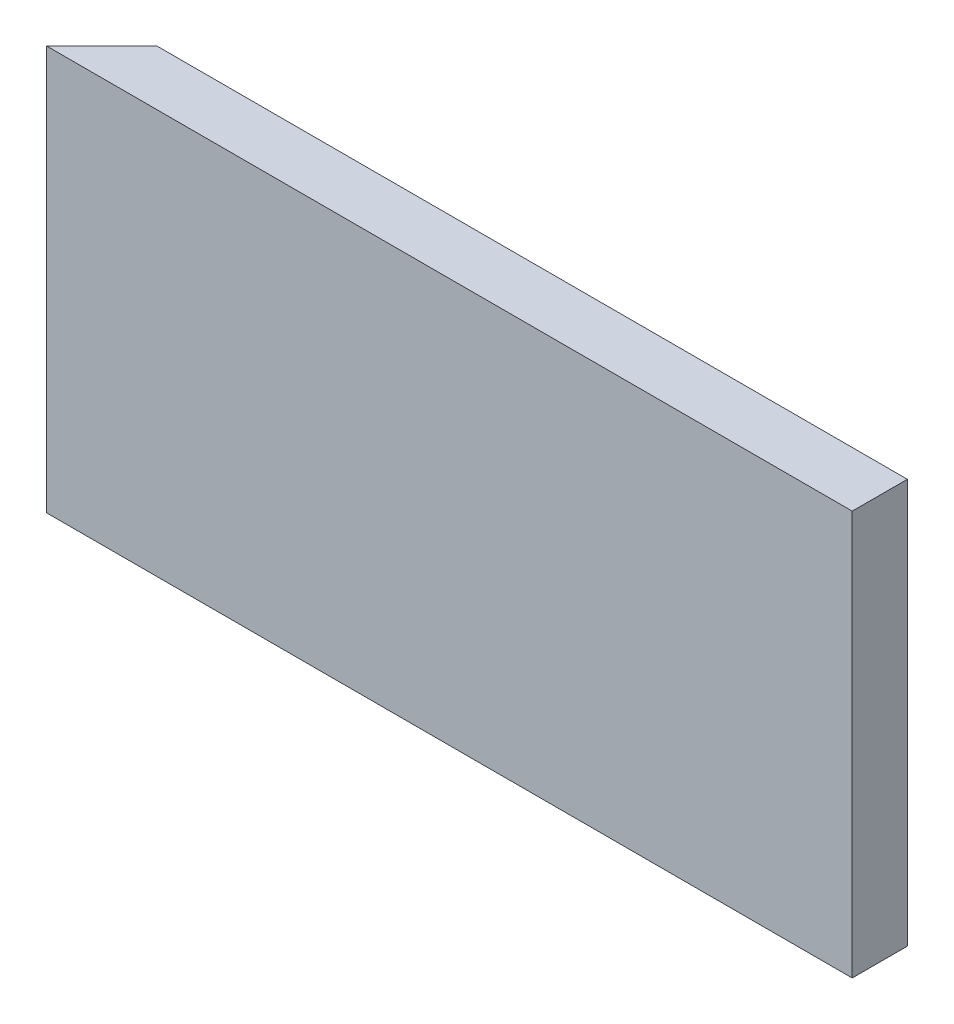
ISO-10303-21;
HEADER;
FILE_DESCRIPTION(('STEP AP214'),'2;1');
FILE_NAME('part.step','',(''),(''),'','','');
FILE_SCHEMA(('AUTOMOTIVE_DESIGN { 1 0 10303 214 1 1 1 1 }'));
ENDSEC;
DATA;
#1=APPLICATION_CONTEXT('core data for automotive mechanical design processes');
#2=APPLICATION_PROTOCOL_DEFINITION('international standard','automotive_design',2000,#1);
#3=PRODUCT_CONTEXT('',#1,'mechanical');
#4=PRODUCT('Part','Part','',(#3));
#5=PRODUCT_RELATED_PRODUCT_CATEGORY('part','',(#4));
#6=PRODUCT_DEFINITION_FORMATION('','',#4);
#7=PRODUCT_DEFINITION_CONTEXT('part definition',#1,'design');
#8=PRODUCT_DEFINITION('design','',#6,#7);
#9=PRODUCT_DEFINITION_SHAPE('','',#8);
#10=(LENGTH_UNIT() NAMED_UNIT(*) SI_UNIT(.MILLI.,.METRE.));
#11=(NAMED_UNIT(*) PLANE_ANGLE_UNIT() SI_UNIT($,.RADIAN.));
#12=(NAMED_UNIT(*) SI_UNIT($,.STERADIAN.) SOLID_ANGLE_UNIT());
#13=UNCERTAINTY_MEASURE_WITH_UNIT(LENGTH_MEASURE(1.E-05),#10,'distance_accuracy_value','');
#14=(GEOMETRIC_REPRESENTATION_CONTEXT(3) GLOBAL_UNCERTAINTY_ASSIGNED_CONTEXT((#13)) GLOBAL_UNIT_ASSIGNED_CONTEXT((#10,
#11,#12)) REPRESENTATION_CONTEXT('',''));
#15=CARTESIAN_POINT('',(0.,0.,0.));
#16=DIRECTION('',(0.,0.,1.));
#17=DIRECTION('',(1.,0.,0.));
#18=AXIS2_PLACEMENT_3D('',#15,#16,#17);
#19=CARTESIAN_POINT('',(0.,0.,18.));
#20=DIRECTION('',(-0.707106781186547,0.,-0.707106781186547));
#21=DIRECTION('',(0.,1.,0.));
#22=AXIS2_PLACEMENT_3D('',#19,#20,#21);
#23=PLANE('',#22);
#24=DIRECTION('',(0.,-1.,0.));
#25=VECTOR('',#24,1.);
#26=CARTESIAN_POINT('',(0.,0.,18.));
#27=LINE('',#26,#25);
#28=CARTESIAN_POINT('',(0.,132.,18.));
#29=VERTEX_POINT('',#28);
#30=CARTESIAN_POINT('',(0.,0.,18.));
#31=VERTEX_POINT('',#30);
#32=EDGE_CURVE('E71',#29,#31,#27,.T.);
#33=ORIENTED_EDGE('',*,*,#32,.F.);
#34=DIRECTION('',(-0.707106781186548,0.,0.707106781186548));
#35=VECTOR('',#34,1.);
#36=CARTESIAN_POINT('',(0.,132.,18.));
#37=LINE('',#36,#35);
#38=CARTESIAN_POINT('',(18.,132.,0.));
#39=VERTEX_POINT('',#38);
#40=EDGE_CURVE('E43',#39,#29,#37,.T.);
#41=ORIENTED_EDGE('',*,*,#40,.F.);
#42=DIRECTION('',(0.,1.,0.));
#43=VECTOR('',#42,1.);
#44=CARTESIAN_POINT('',(18.,132.,0.));
#45=LINE('',#44,#43);
#46=CARTESIAN_POINT('',(18.,0.,0.));
#47=VERTEX_POINT('',#46);
#48=EDGE_CURVE('E72',#47,#39,#45,.T.);
#49=ORIENTED_EDGE('',*,*,#48,.F.);
#50=DIRECTION('',(0.707106781186548,0.,-0.707106781186548));
#51=VECTOR('',#50,1.);
#52=CARTESIAN_POINT('',(0.,0.,18.));
#53=LINE('',#52,#51);
#54=EDGE_CURVE('E13',#31,#47,#53,.T.);
#55=ORIENTED_EDGE('',*,*,#54,.F.);
#56=EDGE_LOOP('',(#33,#41,#49,#55));
#57=FACE_BOUND('',#56,.T.);
#58=ADVANCED_FACE('F36',(#57),#23,.T.);
#59=CARTESIAN_POINT('',(0.,0.,18.));
#60=DIRECTION('',(0.,1.,0.));
#61=DIRECTION('',(0.,0.,1.));
#62=AXIS2_PLACEMENT_3D('',#59,#60,#61);
#63=PLANE('',#62);
#64=DIRECTION('',(1.,0.,0.));
#65=VECTOR('',#64,1.);
#66=CARTESIAN_POINT('',(0.,0.,18.));
#67=LINE('',#66,#65);
#68=CARTESIAN_POINT('',(263.,0.,18.));
#69=VERTEX_POINT('',#68);
#70=EDGE_CURVE('E75',#31,#69,#67,.T.);
#71=ORIENTED_EDGE('',*,*,#70,.F.);
#72=ORIENTED_EDGE('',*,*,#54,.T.);
#73=DIRECTION('',(1.,0.,0.));
#74=VECTOR('',#73,1.);
#75=CARTESIAN_POINT('',(0.,0.,0.));
#76=LINE('',#75,#74);
#77=CARTESIAN_POINT('',(263.,0.,0.));
#78=VERTEX_POINT('',#77);
#79=EDGE_CURVE('E96',#47,#78,#76,.T.);
#80=ORIENTED_EDGE('',*,*,#79,.T.);
#81=DIRECTION('',(0.,0.,-1.));
#82=VECTOR('',#81,1.);
#83=CARTESIAN_POINT('',(263.,0.,18.));
#84=LINE('',#83,#82);
#85=EDGE_CURVE('E78',#69,#78,#84,.T.);
#86=ORIENTED_EDGE('',*,*,#85,.F.);
#87=EDGE_LOOP('',(#71,#72,#80,#86));
#88=FACE_BOUND('',#87,.T.);
#89=ADVANCED_FACE('F76',(#88),#63,.F.);
#90=CARTESIAN_POINT('',(263.,0.,18.));
#91=DIRECTION('',(-1.,0.,0.));
#92=DIRECTION('',(0.,0.,1.));
#93=AXIS2_PLACEMENT_3D('',#90,#91,#92);
#94=PLANE('',#93);
#95=DIRECTION('',(0.,1.,0.));
#96=VECTOR('',#95,1.);
#97=CARTESIAN_POINT('',(263.,0.,0.));
#98=LINE('',#97,#96);
#99=CARTESIAN_POINT('',(263.,132.,0.));
#100=VERTEX_POINT('',#99);
#101=EDGE_CURVE('E90',#78,#100,#98,.T.);
#102=ORIENTED_EDGE('',*,*,#101,.T.);
#103=DIRECTION('',(0.,0.,-1.));
#104=VECTOR('',#103,1.);
#105=CARTESIAN_POINT('',(263.,132.,18.));
#106=LINE('',#105,#104);
#107=CARTESIAN_POINT('',(263.,132.,18.));
#108=VERTEX_POINT('',#107);
#109=EDGE_CURVE('E95',#108,#100,#106,.T.);
#110=ORIENTED_EDGE('',*,*,#109,.F.);
#111=DIRECTION('',(0.,1.,0.));
#112=VECTOR('',#111,1.);
#113=CARTESIAN_POINT('',(263.,0.,18.));
#114=LINE('',#113,#112);
#115=EDGE_CURVE('E81',#69,#108,#114,.T.);
#116=ORIENTED_EDGE('',*,*,#115,.F.);
#117=ORIENTED_EDGE('',*,*,#85,.T.);
#118=EDGE_LOOP('',(#102,#110,#116,#117));
#119=FACE_BOUND('',#118,.T.);
#120=ADVANCED_FACE('F110',(#119),#94,.F.);
#121=CARTESIAN_POINT('',(0.,132.,18.));
#122=DIRECTION('',(0.,-1.,0.));
#123=DIRECTION('',(0.,0.,-1.));
#124=AXIS2_PLACEMENT_3D('',#121,#122,#123);
#125=PLANE('',#124);
#126=DIRECTION('',(-1.,0.,0.));
#127=VECTOR('',#126,1.);
#128=CARTESIAN_POINT('',(0.,132.,0.));
#129=LINE('',#128,#127);
#130=EDGE_CURVE('E87',#100,#39,#129,.T.);
#131=ORIENTED_EDGE('',*,*,#130,.T.);
#132=ORIENTED_EDGE('',*,*,#40,.T.);
#133=DIRECTION('',(-1.,0.,0.));
#134=VECTOR('',#133,1.);
#135=CARTESIAN_POINT('',(0.,132.,18.));
#136=LINE('',#135,#134);
#137=EDGE_CURVE('E86',#108,#29,#136,.T.);
#138=ORIENTED_EDGE('',*,*,#137,.F.);
#139=ORIENTED_EDGE('',*,*,#109,.T.);
#140=EDGE_LOOP('',(#131,#132,#138,#139));
#141=FACE_BOUND('',#140,.T.);
#142=ADVANCED_FACE('F103',(#141),#125,.F.);
#143=CARTESIAN_POINT('',(0.,0.,18.));
#144=DIRECTION('',(0.,0.,-1.));
#145=DIRECTION('',(-1.,0.,0.));
#146=AXIS2_PLACEMENT_3D('',#143,#144,#145);
#147=PLANE('',#146);
#148=ORIENTED_EDGE('',*,*,#32,.T.);
#149=ORIENTED_EDGE('',*,*,#70,.T.);
#150=ORIENTED_EDGE('',*,*,#115,.T.);
#151=ORIENTED_EDGE('',*,*,#137,.T.);
#152=EDGE_LOOP('',(#148,#149,#150,#151));
#153=FACE_BOUND('',#152,.T.);
#154=ADVANCED_FACE('F84',(#153),#147,.F.);
#155=CARTESIAN_POINT('',(0.,0.,0.));
#156=DIRECTION('',(0.,0.,-1.));
#157=DIRECTION('',(-1.,0.,0.));
#158=AXIS2_PLACEMENT_3D('',#155,#156,#157);
#159=PLANE('',#158);
#160=ORIENTED_EDGE('',*,*,#79,.F.);
#161=ORIENTED_EDGE('',*,*,#48,.T.);
#162=ORIENTED_EDGE('',*,*,#130,.F.);
#163=ORIENTED_EDGE('',*,*,#101,.F.);
#164=EDGE_LOOP('',(#160,#161,#162,#163));
#165=FACE_BOUND('',#164,.T.);
#166=ADVANCED_FACE('F108',(#165),#159,.T.);
#167=CLOSED_SHELL('',(#58,#89,#120,#142,#154,#166));
#168=MANIFOLD_SOLID_BREP('B2',#167);
#169=ADVANCED_BREP_SHAPE_REPRESENTATION('',(#18,#168),#14);
#170=SHAPE_DEFINITION_REPRESENTATION(#9,#169);
ENDSEC;
END-ISO-10303-21;
